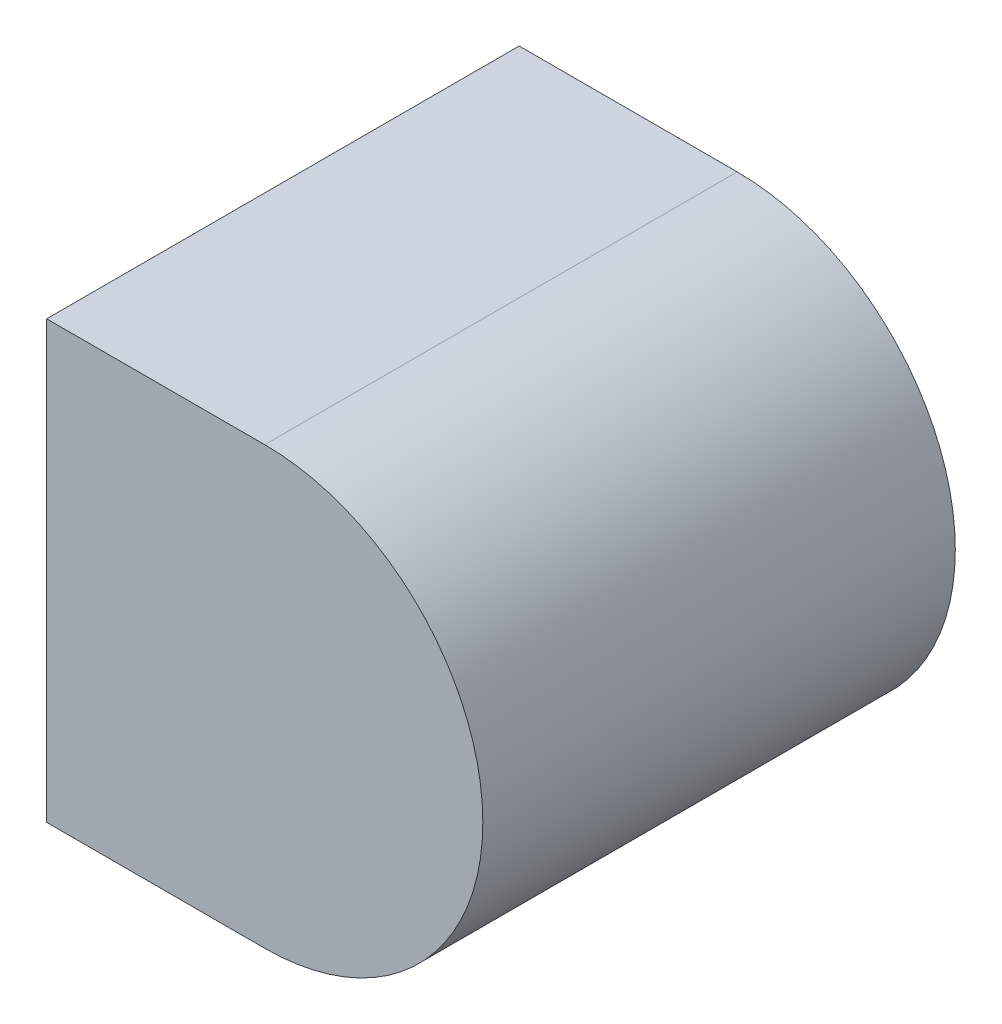
ISO-10303-21;
HEADER;
FILE_DESCRIPTION(('STEP AP214'),'2;1');
FILE_NAME('part.step','',(''),(''),'','','');
FILE_SCHEMA(('AUTOMOTIVE_DESIGN { 1 0 10303 214 1 1 1 1 }'));
ENDSEC;
DATA;
#1=APPLICATION_CONTEXT('core data for automotive mechanical design processes');
#2=APPLICATION_PROTOCOL_DEFINITION('international standard','automotive_design',2000,#1);
#3=PRODUCT_CONTEXT('',#1,'mechanical');
#4=PRODUCT('Part','Part','',(#3));
#5=PRODUCT_RELATED_PRODUCT_CATEGORY('part','',(#4));
#6=PRODUCT_DEFINITION_FORMATION('','',#4);
#7=PRODUCT_DEFINITION_CONTEXT('part definition',#1,'design');
#8=PRODUCT_DEFINITION('design','',#6,#7);
#9=PRODUCT_DEFINITION_SHAPE('','',#8);
#10=(LENGTH_UNIT() NAMED_UNIT(*) SI_UNIT(.MILLI.,.METRE.));
#11=(NAMED_UNIT(*) PLANE_ANGLE_UNIT() SI_UNIT($,.RADIAN.));
#12=(NAMED_UNIT(*) SI_UNIT($,.STERADIAN.) SOLID_ANGLE_UNIT());
#13=UNCERTAINTY_MEASURE_WITH_UNIT(LENGTH_MEASURE(1.E-05),#10,'distance_accuracy_value','');
#14=(GEOMETRIC_REPRESENTATION_CONTEXT(3) GLOBAL_UNCERTAINTY_ASSIGNED_CONTEXT((#13)) GLOBAL_UNIT_ASSIGNED_CONTEXT((#10,
#11,#12)) REPRESENTATION_CONTEXT('',''));
#15=CARTESIAN_POINT('',(0.,0.,0.));
#16=DIRECTION('',(0.,0.,1.));
#17=DIRECTION('',(1.,0.,0.));
#18=AXIS2_PLACEMENT_3D('',#15,#16,#17);
#19=CARTESIAN_POINT('',(1.,0.,3.25));
#20=DIRECTION('',(-1.,0.,0.));
#21=DIRECTION('',(0.,0.,1.));
#22=AXIS2_PLACEMENT_3D('',#19,#20,#21);
#23=CYLINDRICAL_SURFACE('',#22,1.6);
#24=CARTESIAN_POINT('',(0.,0.,3.25));
#25=DIRECTION('',(1.,0.,0.));
#26=DIRECTION('',(0.,0.,1.));
#27=AXIS2_PLACEMENT_3D('',#24,#25,#26);
#28=CIRCLE('',#27,1.6);
#29=CARTESIAN_POINT('',(0.,0.,4.85));
#30=VERTEX_POINT('',#29);
#31=EDGE_CURVE('E34',#30,#30,#28,.T.);
#32=ORIENTED_EDGE('',*,*,#31,.F.);
#33=EDGE_LOOP('',(#32));
#34=FACE_BOUND('',#33,.T.);
#35=CARTESIAN_POINT('',(2.,0.,3.25));
#36=DIRECTION('',(-1.,0.,0.));
#37=DIRECTION('',(0.,0.,1.));
#38=AXIS2_PLACEMENT_3D('',#35,#36,#37);
#39=CIRCLE('',#38,1.6);
#40=CARTESIAN_POINT('',(2.,0.,4.85));
#41=VERTEX_POINT('',#40);
#42=EDGE_CURVE('E11',#41,#41,#39,.T.);
#43=ORIENTED_EDGE('',*,*,#42,.F.);
#44=EDGE_LOOP('',(#43));
#45=FACE_BOUND('',#44,.T.);
#46=ADVANCED_FACE('F17',(#34,#45),#23,.F.);
#47=CARTESIAN_POINT('',(2.,0.,3.25));
#48=DIRECTION('',(1.,0.,0.));
#49=DIRECTION('',(0.,0.707106781186548,0.707106781186548));
#50=AXIS2_PLACEMENT_3D('',#47,#48,#49);
#51=PLANE('',#50);
#52=ORIENTED_EDGE('',*,*,#42,.T.);
#53=EDGE_LOOP('',(#52));
#54=FACE_BOUND('',#53,.T.);
#55=ADVANCED_FACE('F106',(#54),#51,.F.);
#56=CARTESIAN_POINT('',(3.,0.,0.));
#57=DIRECTION('',(0.,0.,1.));
#58=DIRECTION('',(0.,1.,0.));
#59=AXIS2_PLACEMENT_3D('',#56,#57,#58);
#60=CYLINDRICAL_SURFACE('',#59,3.);
#61=CARTESIAN_POINT('',(3.,0.,0.));
#62=DIRECTION('',(0.,0.,-1.));
#63=DIRECTION('',(-1.,0.,0.));
#64=AXIS2_PLACEMENT_3D('',#61,#62,#63);
#65=CIRCLE('',#64,3.);
#66=CARTESIAN_POINT('',(3.,3.,0.));
#67=VERTEX_POINT('',#66);
#68=CARTESIAN_POINT('',(3.,-3.,0.));
#69=VERTEX_POINT('',#68);
#70=EDGE_CURVE('E88',#67,#69,#65,.T.);
#71=ORIENTED_EDGE('',*,*,#70,.F.);
#72=DIRECTION('',(0.,0.,1.));
#73=VECTOR('',#72,1.);
#74=CARTESIAN_POINT('',(3.,3.,0.));
#75=LINE('',#74,#73);
#76=CARTESIAN_POINT('',(3.,3.,6.5));
#77=VERTEX_POINT('',#76);
#78=EDGE_CURVE('E27',#67,#77,#75,.T.);
#79=ORIENTED_EDGE('',*,*,#78,.T.);
#80=CARTESIAN_POINT('',(3.,0.,6.5));
#81=DIRECTION('',(0.,0.,1.));
#82=DIRECTION('',(0.,1.,0.));
#83=AXIS2_PLACEMENT_3D('',#80,#81,#82);
#84=CIRCLE('',#83,3.);
#85=CARTESIAN_POINT('',(3.,-3.,6.5));
#86=VERTEX_POINT('',#85);
#87=EDGE_CURVE('E84',#86,#77,#84,.T.);
#88=ORIENTED_EDGE('',*,*,#87,.F.);
#89=DIRECTION('',(0.,0.,1.));
#90=VECTOR('',#89,1.);
#91=CARTESIAN_POINT('',(3.,-3.,0.));
#92=LINE('',#91,#90);
#93=EDGE_CURVE('E97',#69,#86,#92,.T.);
#94=ORIENTED_EDGE('',*,*,#93,.F.);
#95=EDGE_LOOP('',(#71,#79,#88,#94));
#96=FACE_BOUND('',#95,.T.);
#97=ADVANCED_FACE('F104',(#96),#60,.T.);
#98=CARTESIAN_POINT('',(0.,-3.,0.));
#99=DIRECTION('',(0.,-1.,0.));
#100=DIRECTION('',(0.707106781186548,0.,0.707106781186548));
#101=AXIS2_PLACEMENT_3D('',#98,#99,#100);
#102=PLANE('',#101);
#103=DIRECTION('',(-1.,0.,0.));
#104=VECTOR('',#103,1.);
#105=CARTESIAN_POINT('',(3.,-3.,0.));
#106=LINE('',#105,#104);
#107=CARTESIAN_POINT('',(0.,-3.,0.));
#108=VERTEX_POINT('',#107);
#109=EDGE_CURVE('E86',#69,#108,#106,.T.);
#110=ORIENTED_EDGE('',*,*,#109,.F.);
#111=ORIENTED_EDGE('',*,*,#93,.T.);
#112=DIRECTION('',(1.,0.,0.));
#113=VECTOR('',#112,1.);
#114=CARTESIAN_POINT('',(3.,-3.,6.5));
#115=LINE('',#114,#113);
#116=CARTESIAN_POINT('',(0.,-3.,6.5));
#117=VERTEX_POINT('',#116);
#118=EDGE_CURVE('E76',#117,#86,#115,.T.);
#119=ORIENTED_EDGE('',*,*,#118,.F.);
#120=DIRECTION('',(0.,0.,1.));
#121=VECTOR('',#120,1.);
#122=CARTESIAN_POINT('',(0.,-3.,0.));
#123=LINE('',#122,#121);
#124=EDGE_CURVE('E72',#108,#117,#123,.T.);
#125=ORIENTED_EDGE('',*,*,#124,.F.);
#126=EDGE_LOOP('',(#110,#111,#119,#125));
#127=FACE_BOUND('',#126,.T.);
#128=ADVANCED_FACE('F102',(#127),#102,.T.);
#129=CARTESIAN_POINT('',(0.,3.,0.));
#130=DIRECTION('',(-1.,0.,0.));
#131=DIRECTION('',(0.,0.707106781186548,0.707106781186548));
#132=AXIS2_PLACEMENT_3D('',#129,#130,#131);
#133=PLANE('',#132);
#134=ORIENTED_EDGE('',*,*,#31,.T.);
#135=EDGE_LOOP('',(#134));
#136=FACE_BOUND('',#135,.T.);
#137=DIRECTION('',(0.,1.,0.));
#138=VECTOR('',#137,1.);
#139=CARTESIAN_POINT('',(0.,-3.,0.));
#140=LINE('',#139,#138);
#141=CARTESIAN_POINT('',(0.,3.,0.));
#142=VERTEX_POINT('',#141);
#143=EDGE_CURVE('E60',#108,#142,#140,.T.);
#144=ORIENTED_EDGE('',*,*,#143,.F.);
#145=ORIENTED_EDGE('',*,*,#124,.T.);
#146=DIRECTION('',(0.,-1.,0.));
#147=VECTOR('',#146,1.);
#148=CARTESIAN_POINT('',(0.,-3.,6.5));
#149=LINE('',#148,#147);
#150=CARTESIAN_POINT('',(0.,3.,6.5));
#151=VERTEX_POINT('',#150);
#152=EDGE_CURVE('E66',#151,#117,#149,.T.);
#153=ORIENTED_EDGE('',*,*,#152,.F.);
#154=DIRECTION('',(0.,0.,1.));
#155=VECTOR('',#154,1.);
#156=CARTESIAN_POINT('',(0.,3.,0.));
#157=LINE('',#156,#155);
#158=EDGE_CURVE('E69',#142,#151,#157,.T.);
#159=ORIENTED_EDGE('',*,*,#158,.F.);
#160=EDGE_LOOP('',(#144,#145,#153,#159));
#161=FACE_BOUND('',#160,.T.);
#162=ADVANCED_FACE('F68',(#136,#161),#133,.T.);
#163=CARTESIAN_POINT('',(3.,3.,0.));
#164=DIRECTION('',(0.,1.,0.));
#165=DIRECTION('',(0.707106781186548,0.,0.707106781186548));
#166=AXIS2_PLACEMENT_3D('',#163,#164,#165);
#167=PLANE('',#166);
#168=DIRECTION('',(1.,0.,0.));
#169=VECTOR('',#168,1.);
#170=CARTESIAN_POINT('',(0.,3.,0.));
#171=LINE('',#170,#169);
#172=EDGE_CURVE('E82',#142,#67,#171,.T.);
#173=ORIENTED_EDGE('',*,*,#172,.F.);
#174=ORIENTED_EDGE('',*,*,#158,.T.);
#175=DIRECTION('',(-1.,0.,0.));
#176=VECTOR('',#175,1.);
#177=CARTESIAN_POINT('',(0.,3.,6.5));
#178=LINE('',#177,#176);
#179=EDGE_CURVE('E21',#77,#151,#178,.T.);
#180=ORIENTED_EDGE('',*,*,#179,.F.);
#181=ORIENTED_EDGE('',*,*,#78,.F.);
#182=EDGE_LOOP('',(#173,#174,#180,#181));
#183=FACE_BOUND('',#182,.T.);
#184=ADVANCED_FACE('F80',(#183),#167,.T.);
#185=CARTESIAN_POINT('',(2.29202958124357,0.,0.));
#186=DIRECTION('',(0.,0.,1.));
#187=DIRECTION('',(0.707106781186548,0.707106781186548,0.));
#188=AXIS2_PLACEMENT_3D('',#185,#186,#187);
#189=PLANE('',#188);
#190=ORIENTED_EDGE('',*,*,#172,.T.);
#191=ORIENTED_EDGE('',*,*,#70,.T.);
#192=ORIENTED_EDGE('',*,*,#109,.T.);
#193=ORIENTED_EDGE('',*,*,#143,.T.);
#194=EDGE_LOOP('',(#190,#191,#192,#193));
#195=FACE_BOUND('',#194,.T.);
#196=ADVANCED_FACE('F165',(#195),#189,.F.);
#197=CARTESIAN_POINT('',(2.29202958124357,0.,6.5));
#198=DIRECTION('',(0.,0.,1.));
#199=DIRECTION('',(0.707106781186548,0.707106781186548,0.));
#200=AXIS2_PLACEMENT_3D('',#197,#198,#199);
#201=PLANE('',#200);
#202=ORIENTED_EDGE('',*,*,#179,.T.);
#203=ORIENTED_EDGE('',*,*,#152,.T.);
#204=ORIENTED_EDGE('',*,*,#118,.T.);
#205=ORIENTED_EDGE('',*,*,#87,.T.);
#206=EDGE_LOOP('',(#202,#203,#204,#205));
#207=FACE_BOUND('',#206,.T.);
#208=ADVANCED_FACE('F19',(#207),#201,.T.);
#209=CLOSED_SHELL('',(#46,#55,#97,#128,#162,#184,#196,#208));
#210=MANIFOLD_SOLID_BREP('B1',#209);
#211=ADVANCED_BREP_SHAPE_REPRESENTATION('',(#18,#210),#14);
#212=SHAPE_DEFINITION_REPRESENTATION(#9,#211);
ENDSEC;
END-ISO-10303-21;
